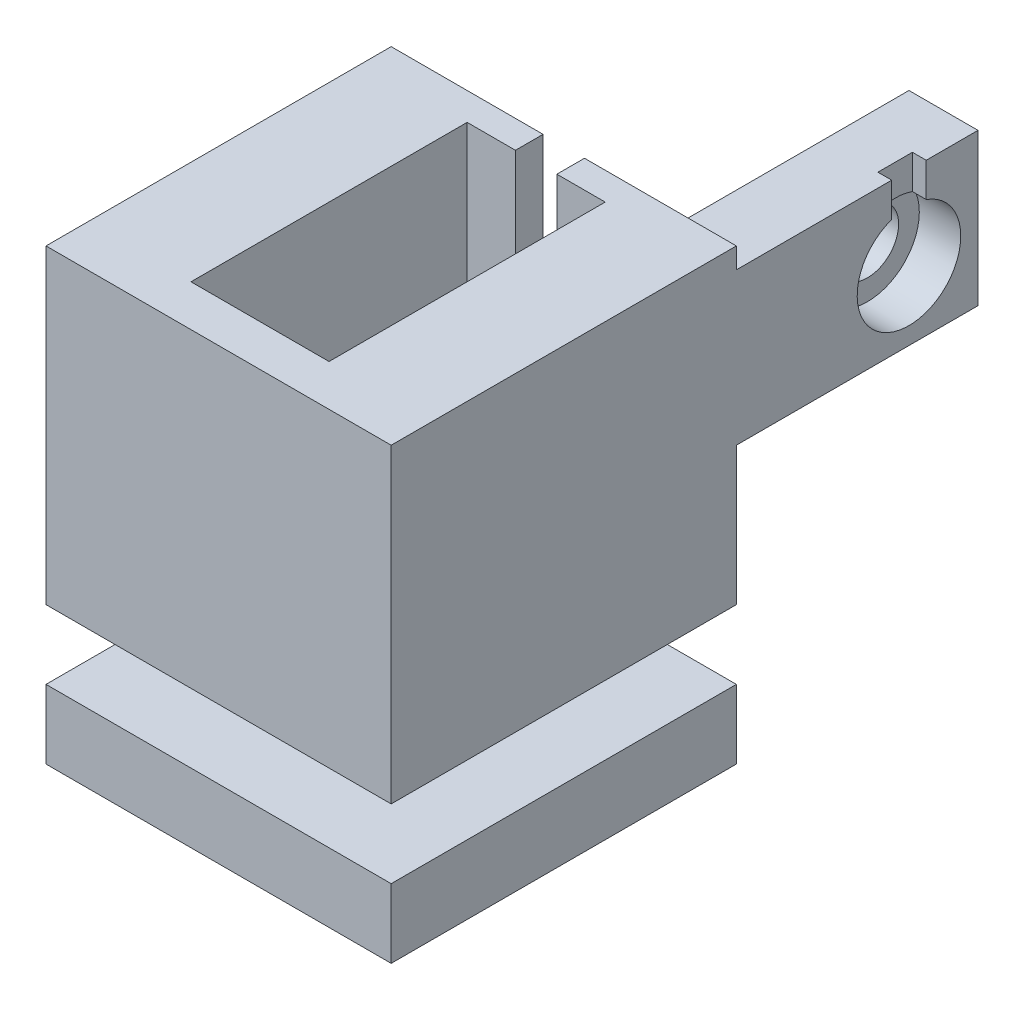
ISO-10303-21;
HEADER;
FILE_DESCRIPTION(('STEP AP214'),'2;1');
FILE_NAME('part.step','',(''),(''),'','','');
FILE_SCHEMA(('AUTOMOTIVE_DESIGN { 1 0 10303 214 1 1 1 1 }'));
ENDSEC;
DATA;
#1=APPLICATION_CONTEXT('core data for automotive mechanical design processes');
#2=APPLICATION_PROTOCOL_DEFINITION('international standard','automotive_design',2000,#1);
#3=PRODUCT_CONTEXT('',#1,'mechanical');
#4=PRODUCT('Part','Part','',(#3));
#5=PRODUCT_RELATED_PRODUCT_CATEGORY('part','',(#4));
#6=PRODUCT_DEFINITION_FORMATION('','',#4);
#7=PRODUCT_DEFINITION_CONTEXT('part definition',#1,'design');
#8=PRODUCT_DEFINITION('design','',#6,#7);
#9=PRODUCT_DEFINITION_SHAPE('','',#8);
#10=(LENGTH_UNIT() NAMED_UNIT(*) SI_UNIT(.MILLI.,.METRE.));
#11=(NAMED_UNIT(*) PLANE_ANGLE_UNIT() SI_UNIT($,.RADIAN.));
#12=(NAMED_UNIT(*) SI_UNIT($,.STERADIAN.) SOLID_ANGLE_UNIT());
#13=UNCERTAINTY_MEASURE_WITH_UNIT(LENGTH_MEASURE(1.E-05),#10,'distance_accuracy_value','');
#14=(GEOMETRIC_REPRESENTATION_CONTEXT(3) GLOBAL_UNCERTAINTY_ASSIGNED_CONTEXT((#13)) GLOBAL_UNIT_ASSIGNED_CONTEXT((#10,
#11,#12)) REPRESENTATION_CONTEXT('',''));
#15=CARTESIAN_POINT('',(0.,0.,0.));
#16=DIRECTION('',(0.,0.,1.));
#17=DIRECTION('',(1.,0.,0.));
#18=AXIS2_PLACEMENT_3D('',#15,#16,#17);
#19=CARTESIAN_POINT('',(-25.,40.,-25.));
#20=DIRECTION('',(0.,0.,1.));
#21=DIRECTION('',(1.,0.,0.));
#22=AXIS2_PLACEMENT_3D('',#19,#20,#21);
#23=PLANE('',#22);
#24=DIRECTION('',(0.,-1.,0.));
#25=VECTOR('',#24,1.);
#26=CARTESIAN_POINT('',(-25.,40.,-25.));
#27=LINE('',#26,#25);
#28=CARTESIAN_POINT('',(-25.0000000000001,10.,-24.9999999999999));
#29=VERTEX_POINT('',#28);
#30=CARTESIAN_POINT('',(-25.,0.,-25.));
#31=VERTEX_POINT('',#30);
#32=EDGE_CURVE('E379',#29,#31,#27,.T.);
#33=ORIENTED_EDGE('',*,*,#32,.F.);
#34=DIRECTION('',(1.,0.,0.));
#35=VECTOR('',#34,1.);
#36=CARTESIAN_POINT('',(15.,10.,-25.));
#37=LINE('',#36,#35);
#38=CARTESIAN_POINT('',(25.,10.,-25.));
#39=VERTEX_POINT('',#38);
#40=EDGE_CURVE('E462',#29,#39,#37,.T.);
#41=ORIENTED_EDGE('',*,*,#40,.T.);
#42=DIRECTION('',(0.,-1.,0.));
#43=VECTOR('',#42,1.);
#44=CARTESIAN_POINT('',(25.,40.,-25.));
#45=LINE('',#44,#43);
#46=CARTESIAN_POINT('',(25.,0.,-25.));
#47=VERTEX_POINT('',#46);
#48=EDGE_CURVE('E383',#39,#47,#45,.T.);
#49=ORIENTED_EDGE('',*,*,#48,.T.);
#50=DIRECTION('',(-1.,0.,0.));
#51=VECTOR('',#50,1.);
#52=CARTESIAN_POINT('',(-25.,0.,-25.));
#53=LINE('',#52,#51);
#54=EDGE_CURVE('E362',#47,#31,#53,.T.);
#55=ORIENTED_EDGE('',*,*,#54,.T.);
#56=EDGE_LOOP('',(#33,#41,#49,#55));
#57=FACE_BOUND('',#56,.T.);
#58=ADVANCED_FACE('F39',(#57),#23,.F.);
#59=CARTESIAN_POINT('',(-25.,40.,-25.));
#60=DIRECTION('',(1.,0.,0.));
#61=DIRECTION('',(0.,0.,-1.));
#62=AXIS2_PLACEMENT_3D('',#59,#60,#61);
#63=PLANE('',#62);
#64=DIRECTION('',(0.,-1.,0.));
#65=VECTOR('',#64,1.);
#66=CARTESIAN_POINT('',(-25.,40.,25.));
#67=LINE('',#66,#65);
#68=CARTESIAN_POINT('',(-25.,10.,25.));
#69=VERTEX_POINT('',#68);
#70=CARTESIAN_POINT('',(-25.,0.,25.));
#71=VERTEX_POINT('',#70);
#72=EDGE_CURVE('E375',#69,#71,#67,.T.);
#73=ORIENTED_EDGE('',*,*,#72,.F.);
#74=DIRECTION('',(0.,0.,-1.));
#75=VECTOR('',#74,1.);
#76=CARTESIAN_POINT('',(-25.0000000000001,10.,-14.9999999999999));
#77=LINE('',#76,#75);
#78=EDGE_CURVE('E446',#69,#29,#77,.T.);
#79=ORIENTED_EDGE('',*,*,#78,.T.);
#80=ORIENTED_EDGE('',*,*,#32,.T.);
#81=DIRECTION('',(0.,0.,1.));
#82=VECTOR('',#81,1.);
#83=CARTESIAN_POINT('',(-25.,0.,-25.));
#84=LINE('',#83,#82);
#85=EDGE_CURVE('E365',#31,#71,#84,.T.);
#86=ORIENTED_EDGE('',*,*,#85,.T.);
#87=EDGE_LOOP('',(#73,#79,#80,#86));
#88=FACE_BOUND('',#87,.T.);
#89=ADVANCED_FACE('F514',(#88),#63,.F.);
#90=CARTESIAN_POINT('',(-25.,40.,25.));
#91=DIRECTION('',(0.,0.,-1.));
#92=DIRECTION('',(-1.,0.,0.));
#93=AXIS2_PLACEMENT_3D('',#90,#91,#92);
#94=PLANE('',#93);
#95=DIRECTION('',(1.,0.,0.));
#96=VECTOR('',#95,1.);
#97=CARTESIAN_POINT('',(15.,9.99999999999999,25.));
#98=LINE('',#97,#96);
#99=CARTESIAN_POINT('',(25.,9.99999999999999,25.));
#100=VERTEX_POINT('',#99);
#101=EDGE_CURVE('E465',#69,#100,#98,.T.);
#102=ORIENTED_EDGE('',*,*,#101,.F.);
#103=ORIENTED_EDGE('',*,*,#72,.T.);
#104=DIRECTION('',(1.,0.,0.));
#105=VECTOR('',#104,1.);
#106=CARTESIAN_POINT('',(-25.,0.,25.));
#107=LINE('',#106,#105);
#108=CARTESIAN_POINT('',(25.,0.,25.));
#109=VERTEX_POINT('',#108);
#110=EDGE_CURVE('E368',#71,#109,#107,.T.);
#111=ORIENTED_EDGE('',*,*,#110,.T.);
#112=DIRECTION('',(0.,-1.,0.));
#113=VECTOR('',#112,1.);
#114=CARTESIAN_POINT('',(25.,40.,25.));
#115=LINE('',#114,#113);
#116=EDGE_CURVE('E371',#100,#109,#115,.T.);
#117=ORIENTED_EDGE('',*,*,#116,.F.);
#118=EDGE_LOOP('',(#102,#103,#111,#117));
#119=FACE_BOUND('',#118,.T.);
#120=ADVANCED_FACE('F509',(#119),#94,.F.);
#121=CARTESIAN_POINT('',(25.,40.,-25.));
#122=DIRECTION('',(-1.,0.,0.));
#123=DIRECTION('',(0.,0.,1.));
#124=AXIS2_PLACEMENT_3D('',#121,#122,#123);
#125=PLANE('',#124);
#126=ORIENTED_EDGE('',*,*,#48,.F.);
#127=DIRECTION('',(0.,0.,-1.));
#128=VECTOR('',#127,1.);
#129=CARTESIAN_POINT('',(25.,10.,-25.));
#130=LINE('',#129,#128);
#131=EDGE_CURVE('E456',#100,#39,#130,.T.);
#132=ORIENTED_EDGE('',*,*,#131,.F.);
#133=ORIENTED_EDGE('',*,*,#116,.T.);
#134=DIRECTION('',(0.,0.,-1.));
#135=VECTOR('',#134,1.);
#136=CARTESIAN_POINT('',(25.,0.,-25.));
#137=LINE('',#136,#135);
#138=EDGE_CURVE('E359',#109,#47,#137,.T.);
#139=ORIENTED_EDGE('',*,*,#138,.T.);
#140=EDGE_LOOP('',(#126,#132,#133,#139));
#141=FACE_BOUND('',#140,.T.);
#142=ADVANCED_FACE('F501',(#141),#125,.F.);
#143=CARTESIAN_POINT('',(-20.,50.,-25.));
#144=DIRECTION('',(0.,0.,-1.));
#145=DIRECTION('',(-1.,0.,0.));
#146=AXIS2_PLACEMENT_3D('',#143,#144,#145);
#147=CIRCLE('',#146,2.00000000000001);
#148=CARTESIAN_POINT('',(-22.,50.,-25.));
#149=VERTEX_POINT('',#148);
#150=EDGE_CURVE('E947',#149,#149,#147,.T.);
#151=ORIENTED_EDGE('',*,*,#150,.F.);
#152=EDGE_LOOP('',(#151));
#153=FACE_BOUND('',#152,.T.);
#154=DIRECTION('',(1.,0.,0.));
#155=VECTOR('',#154,1.);
#156=CARTESIAN_POINT('',(15.,20.,-25.));
#157=LINE('',#156,#155);
#158=CARTESIAN_POINT('',(-25.0000000000001,20.,-24.9999999999999));
#159=VERTEX_POINT('',#158);
#160=CARTESIAN_POINT('',(25.,20.,-25.));
#161=VERTEX_POINT('',#160);
#162=EDGE_CURVE('E459',#159,#161,#157,.T.);
#163=ORIENTED_EDGE('',*,*,#162,.F.);
#164=CARTESIAN_POINT('',(-25.,65.,-25.));
#165=VERTEX_POINT('',#164);
#166=EDGE_CURVE('E380',#165,#159,#27,.T.);
#167=ORIENTED_EDGE('',*,*,#166,.F.);
#168=DIRECTION('',(-1.,0.,0.));
#169=VECTOR('',#168,1.);
#170=CARTESIAN_POINT('',(-25.,65.,-25.));
#171=LINE('',#170,#169);
#172=CARTESIAN_POINT('',(-3.,65.,-25.));
#173=VERTEX_POINT('',#172);
#174=EDGE_CURVE('E352',#173,#165,#171,.T.);
#175=ORIENTED_EDGE('',*,*,#174,.F.);
#176=DIRECTION('',(0.,1.,0.));
#177=VECTOR('',#176,1.);
#178=CARTESIAN_POINT('',(-3.,65.,-25.));
#179=LINE('',#178,#177);
#180=CARTESIAN_POINT('',(-3.,45.,-25.));
#181=VERTEX_POINT('',#180);
#182=EDGE_CURVE('E292',#181,#173,#179,.T.);
#183=ORIENTED_EDGE('',*,*,#182,.F.);
#184=DIRECTION('',(-1.,0.,0.));
#185=VECTOR('',#184,1.);
#186=CARTESIAN_POINT('',(3.,45.,-25.));
#187=LINE('',#186,#185);
#188=CARTESIAN_POINT('',(3.,45.,-25.));
#189=VERTEX_POINT('',#188);
#190=EDGE_CURVE('E289',#189,#181,#187,.T.);
#191=ORIENTED_EDGE('',*,*,#190,.F.);
#192=DIRECTION('',(0.,-1.,0.));
#193=VECTOR('',#192,1.);
#194=CARTESIAN_POINT('',(3.,65.,-25.));
#195=LINE('',#194,#193);
#196=CARTESIAN_POINT('',(3.,65.,-25.));
#197=VERTEX_POINT('',#196);
#198=EDGE_CURVE('E286',#197,#189,#195,.T.);
#199=ORIENTED_EDGE('',*,*,#198,.F.);
#200=CARTESIAN_POINT('',(25.,65.,-25.));
#201=VERTEX_POINT('',#200);
#202=EDGE_CURVE('E353',#201,#197,#171,.T.);
#203=ORIENTED_EDGE('',*,*,#202,.F.);
#204=CARTESIAN_POINT('',(25.,62.,-25.));
#205=VERTEX_POINT('',#204);
#206=EDGE_CURVE('E392',#201,#205,#45,.T.);
#207=ORIENTED_EDGE('',*,*,#206,.T.);
#208=DIRECTION('',(1.,0.,0.));
#209=VECTOR('',#208,1.);
#210=CARTESIAN_POINT('',(25.,62.,-25.));
#211=LINE('',#210,#209);
#212=CARTESIAN_POINT('',(15.,62.,-25.));
#213=VERTEX_POINT('',#212);
#214=EDGE_CURVE('E250',#213,#205,#211,.T.);
#215=ORIENTED_EDGE('',*,*,#214,.F.);
#216=DIRECTION('',(0.,1.,0.));
#217=VECTOR('',#216,1.);
#218=CARTESIAN_POINT('',(15.,40.,-25.));
#219=LINE('',#218,#217);
#220=CARTESIAN_POINT('',(15.,40.,-25.));
#221=VERTEX_POINT('',#220);
#222=EDGE_CURVE('E272',#221,#213,#219,.T.);
#223=ORIENTED_EDGE('',*,*,#222,.F.);
#224=DIRECTION('',(-1.,0.,0.));
#225=VECTOR('',#224,1.);
#226=CARTESIAN_POINT('',(25.,40.,-25.));
#227=LINE('',#226,#225);
#228=CARTESIAN_POINT('',(25.,40.,-25.));
#229=VERTEX_POINT('',#228);
#230=EDGE_CURVE('E479',#229,#221,#227,.T.);
#231=ORIENTED_EDGE('',*,*,#230,.F.);
#232=EDGE_CURVE('E390',#229,#161,#45,.T.);
#233=ORIENTED_EDGE('',*,*,#232,.T.);
#234=EDGE_LOOP('',(#163,#167,#175,#183,#191,#199,#203,#207,#215,#223,#231,#233));
#235=FACE_BOUND('',#234,.T.);
#236=ADVANCED_FACE('F497',(#153,#235),#23,.F.);
#237=CARTESIAN_POINT('',(0.,0.,0.));
#238=DIRECTION('',(0.,1.,0.));
#239=DIRECTION('',(0.,0.,1.));
#240=AXIS2_PLACEMENT_3D('',#237,#238,#239);
#241=CYLINDRICAL_SURFACE('',#240,4.);
#242=CARTESIAN_POINT('',(0.,0.,0.));
#243=DIRECTION('',(0.,1.,0.));
#244=DIRECTION('',(0.,0.,1.));
#245=AXIS2_PLACEMENT_3D('',#242,#243,#244);
#246=CIRCLE('',#245,4.);
#247=CARTESIAN_POINT('',(0.,0.,4.));
#248=VERTEX_POINT('',#247);
#249=EDGE_CURVE('E313',#248,#248,#246,.T.);
#250=ORIENTED_EDGE('',*,*,#249,.F.);
#251=EDGE_LOOP('',(#250));
#252=FACE_BOUND('',#251,.T.);
#253=CARTESIAN_POINT('',(0.,15.,0.));
#254=DIRECTION('',(0.,1.,0.));
#255=DIRECTION('',(0.,0.,1.));
#256=AXIS2_PLACEMENT_3D('',#253,#254,#255);
#257=CIRCLE('',#256,4.);
#258=CARTESIAN_POINT('',(0.,15.,4.));
#259=VERTEX_POINT('',#258);
#260=EDGE_CURVE('E310',#259,#259,#257,.F.);
#261=ORIENTED_EDGE('',*,*,#260,.F.);
#262=EDGE_LOOP('',(#261));
#263=FACE_BOUND('',#262,.T.);
#264=ADVANCED_FACE('F500',(#252,#263),#241,.F.);
#265=DIRECTION('',(0.,0.,1.));
#266=VECTOR('',#265,1.);
#267=CARTESIAN_POINT('',(25.,62.,-60.));
#268=LINE('',#267,#266);
#269=CARTESIAN_POINT('',(25.,62.,-60.));
#270=VERTEX_POINT('',#269);
#271=CARTESIAN_POINT('',(25.,62.,-52.5));
#272=VERTEX_POINT('',#271);
#273=EDGE_CURVE('E251',#270,#272,#268,.T.);
#274=ORIENTED_EDGE('',*,*,#273,.T.);
#275=DIRECTION('',(0.,1.,0.));
#276=VECTOR('',#275,1.);
#277=CARTESIAN_POINT('',(25.,55.,-52.5));
#278=LINE('',#277,#276);
#279=CARTESIAN_POINT('',(25.,57.0710678118655,-52.5));
#280=VERTEX_POINT('',#279);
#281=EDGE_CURVE('E244',#280,#272,#278,.T.);
#282=ORIENTED_EDGE('',*,*,#281,.F.);
#283=CARTESIAN_POINT('',(25.,50.,-50.));
#284=DIRECTION('',(1.,0.,0.));
#285=DIRECTION('',(0.,0.,-1.));
#286=AXIS2_PLACEMENT_3D('',#283,#284,#285);
#287=CIRCLE('',#286,7.5);
#288=CARTESIAN_POINT('',(25.,57.0710678118655,-47.5));
#289=VERTEX_POINT('',#288);
#290=EDGE_CURVE('E243',#289,#280,#287,.T.);
#291=ORIENTED_EDGE('',*,*,#290,.F.);
#292=DIRECTION('',(0.,-1.,0.));
#293=VECTOR('',#292,1.);
#294=CARTESIAN_POINT('',(25.,55.,-47.5));
#295=LINE('',#294,#293);
#296=CARTESIAN_POINT('',(25.,62.,-47.5));
#297=VERTEX_POINT('',#296);
#298=EDGE_CURVE('E229',#297,#289,#295,.T.);
#299=ORIENTED_EDGE('',*,*,#298,.F.);
#300=EDGE_CURVE('E43',#297,#205,#268,.T.);
#301=ORIENTED_EDGE('',*,*,#300,.T.);
#302=ORIENTED_EDGE('',*,*,#206,.F.);
#303=DIRECTION('',(0.,0.,-1.));
#304=VECTOR('',#303,1.);
#305=CARTESIAN_POINT('',(25.,65.,25.));
#306=LINE('',#305,#304);
#307=CARTESIAN_POINT('',(25.,65.,25.));
#308=VERTEX_POINT('',#307);
#309=EDGE_CURVE('E349',#308,#201,#306,.T.);
#310=ORIENTED_EDGE('',*,*,#309,.F.);
#311=CARTESIAN_POINT('',(25.,20.,25.));
#312=VERTEX_POINT('',#311);
#313=EDGE_CURVE('E372',#308,#312,#115,.T.);
#314=ORIENTED_EDGE('',*,*,#313,.T.);
#315=DIRECTION('',(0.,0.,1.));
#316=VECTOR('',#315,1.);
#317=CARTESIAN_POINT('',(25.,20.,-25.));
#318=LINE('',#317,#316);
#319=EDGE_CURVE('E449',#161,#312,#318,.T.);
#320=ORIENTED_EDGE('',*,*,#319,.F.);
#321=ORIENTED_EDGE('',*,*,#232,.F.);
#322=DIRECTION('',(0.,0.,1.));
#323=VECTOR('',#322,1.);
#324=CARTESIAN_POINT('',(25.,40.,-60.));
#325=LINE('',#324,#323);
#326=CARTESIAN_POINT('',(25.,40.,-60.));
#327=VERTEX_POINT('',#326);
#328=EDGE_CURVE('E252',#327,#229,#325,.T.);
#329=ORIENTED_EDGE('',*,*,#328,.F.);
#330=DIRECTION('',(0.,-1.,0.));
#331=VECTOR('',#330,1.);
#332=CARTESIAN_POINT('',(25.,62.,-60.));
#333=LINE('',#332,#331);
#334=EDGE_CURVE('E256',#270,#327,#333,.T.);
#335=ORIENTED_EDGE('',*,*,#334,.F.);
#336=EDGE_LOOP('',(#274,#282,#291,#299,#301,#302,#310,#314,#320,#321,#329,#335));
#337=FACE_BOUND('',#336,.T.);
#338=ADVANCED_FACE('F41',(#337),#125,.F.);
#339=ORIENTED_EDGE('',*,*,#166,.T.);
#340=DIRECTION('',(0.,0.,-1.));
#341=VECTOR('',#340,1.);
#342=CARTESIAN_POINT('',(-25.0000000000001,20.,-14.9999999999999));
#343=LINE('',#342,#341);
#344=CARTESIAN_POINT('',(-25.,20.,25.));
#345=VERTEX_POINT('',#344);
#346=EDGE_CURVE('E445',#345,#159,#343,.T.);
#347=ORIENTED_EDGE('',*,*,#346,.F.);
#348=CARTESIAN_POINT('',(-25.,65.,25.));
#349=VERTEX_POINT('',#348);
#350=EDGE_CURVE('E376',#349,#345,#67,.T.);
#351=ORIENTED_EDGE('',*,*,#350,.F.);
#352=DIRECTION('',(0.,0.,1.));
#353=VECTOR('',#352,1.);
#354=CARTESIAN_POINT('',(-25.,65.,-25.));
#355=LINE('',#354,#353);
#356=EDGE_CURVE('E356',#165,#349,#355,.T.);
#357=ORIENTED_EDGE('',*,*,#356,.F.);
#358=EDGE_LOOP('',(#339,#347,#351,#357));
#359=FACE_BOUND('',#358,.T.);
#360=ADVANCED_FACE('F519',(#359),#63,.F.);
#361=ORIENTED_EDGE('',*,*,#350,.T.);
#362=DIRECTION('',(1.,0.,0.));
#363=VECTOR('',#362,1.);
#364=CARTESIAN_POINT('',(15.,20.,25.));
#365=LINE('',#364,#363);
#366=EDGE_CURVE('E467',#345,#312,#365,.T.);
#367=ORIENTED_EDGE('',*,*,#366,.T.);
#368=ORIENTED_EDGE('',*,*,#313,.F.);
#369=DIRECTION('',(1.,0.,0.));
#370=VECTOR('',#369,1.);
#371=CARTESIAN_POINT('',(-25.,65.,25.));
#372=LINE('',#371,#370);
#373=EDGE_CURVE('E346',#349,#308,#372,.T.);
#374=ORIENTED_EDGE('',*,*,#373,.F.);
#375=EDGE_LOOP('',(#361,#367,#368,#374));
#376=FACE_BOUND('',#375,.T.);
#377=ADVANCED_FACE('F535',(#376),#94,.F.);
#378=CARTESIAN_POINT('',(0.,0.,0.));
#379=DIRECTION('',(0.,1.,0.));
#380=DIRECTION('',(0.,0.,1.));
#381=AXIS2_PLACEMENT_3D('',#378,#379,#380);
#382=PLANE('',#381);
#383=ORIENTED_EDGE('',*,*,#249,.T.);
#384=EDGE_LOOP('',(#383));
#385=FACE_BOUND('',#384,.T.);
#386=ORIENTED_EDGE('',*,*,#138,.F.);
#387=ORIENTED_EDGE('',*,*,#110,.F.);
#388=ORIENTED_EDGE('',*,*,#85,.F.);
#389=ORIENTED_EDGE('',*,*,#54,.F.);
#390=EDGE_LOOP('',(#386,#387,#388,#389));
#391=FACE_BOUND('',#390,.T.);
#392=ADVANCED_FACE('F532',(#385,#391),#382,.F.);
#393=CARTESIAN_POINT('',(0.,65.,0.));
#394=DIRECTION('',(0.,1.,0.));
#395=DIRECTION('',(0.,0.,1.));
#396=AXIS2_PLACEMENT_3D('',#393,#394,#395);
#397=PLANE('',#396);
#398=DIRECTION('',(0.,0.,-1.));
#399=VECTOR('',#398,1.);
#400=CARTESIAN_POINT('',(3.,65.,25.001));
#401=LINE('',#400,#399);
#402=CARTESIAN_POINT('',(3.,65.,-21.));
#403=VERTEX_POINT('',#402);
#404=EDGE_CURVE('E294',#403,#197,#401,.T.);
#405=ORIENTED_EDGE('',*,*,#404,.F.);
#406=DIRECTION('',(-1.,0.,0.));
#407=VECTOR('',#406,1.);
#408=CARTESIAN_POINT('',(-10.,65.,-21.));
#409=LINE('',#408,#407);
#410=CARTESIAN_POINT('',(10.,65.,-21.));
#411=VERTEX_POINT('',#410);
#412=EDGE_CURVE('E323',#411,#403,#409,.T.);
#413=ORIENTED_EDGE('',*,*,#412,.F.);
#414=DIRECTION('',(0.,0.,-1.));
#415=VECTOR('',#414,1.);
#416=CARTESIAN_POINT('',(10.,65.,-21.));
#417=LINE('',#416,#415);
#418=CARTESIAN_POINT('',(10.,65.,19.));
#419=VERTEX_POINT('',#418);
#420=EDGE_CURVE('E319',#419,#411,#417,.T.);
#421=ORIENTED_EDGE('',*,*,#420,.F.);
#422=DIRECTION('',(1.,0.,0.));
#423=VECTOR('',#422,1.);
#424=CARTESIAN_POINT('',(-9.99999999999999,65.,19.));
#425=LINE('',#424,#423);
#426=CARTESIAN_POINT('',(-9.99999999999999,65.,19.));
#427=VERTEX_POINT('',#426);
#428=EDGE_CURVE('E317',#427,#419,#425,.T.);
#429=ORIENTED_EDGE('',*,*,#428,.F.);
#430=DIRECTION('',(0.,0.,1.));
#431=VECTOR('',#430,1.);
#432=CARTESIAN_POINT('',(-10.,65.,-21.));
#433=LINE('',#432,#431);
#434=CARTESIAN_POINT('',(-10.,65.,-21.));
#435=VERTEX_POINT('',#434);
#436=EDGE_CURVE('E326',#435,#427,#433,.T.);
#437=ORIENTED_EDGE('',*,*,#436,.F.);
#438=CARTESIAN_POINT('',(-3.,65.,-21.));
#439=VERTEX_POINT('',#438);
#440=EDGE_CURVE('E322',#439,#435,#409,.T.);
#441=ORIENTED_EDGE('',*,*,#440,.F.);
#442=DIRECTION('',(0.,0.,-1.));
#443=VECTOR('',#442,1.);
#444=CARTESIAN_POINT('',(-3.,65.,25.001));
#445=LINE('',#444,#443);
#446=EDGE_CURVE('E295',#439,#173,#445,.T.);
#447=ORIENTED_EDGE('',*,*,#446,.T.);
#448=ORIENTED_EDGE('',*,*,#174,.T.);
#449=ORIENTED_EDGE('',*,*,#356,.T.);
#450=ORIENTED_EDGE('',*,*,#373,.T.);
#451=ORIENTED_EDGE('',*,*,#309,.T.);
#452=ORIENTED_EDGE('',*,*,#202,.T.);
#453=EDGE_LOOP('',(#405,#413,#421,#429,#437,#441,#447,#448,#449,#450,#451,#452));
#454=FACE_BOUND('',#453,.T.);
#455=ADVANCED_FACE('F534',(#454),#397,.T.);
#456=CARTESIAN_POINT('',(-9.99999999999999,65.,19.));
#457=DIRECTION('',(0.,0.,-1.));
#458=DIRECTION('',(-1.,0.,0.));
#459=AXIS2_PLACEMENT_3D('',#456,#457,#458);
#460=PLANE('',#459);
#461=DIRECTION('',(1.,0.,0.));
#462=VECTOR('',#461,1.);
#463=CARTESIAN_POINT('',(-9.99999999999999,40.,19.));
#464=LINE('',#463,#462);
#465=CARTESIAN_POINT('',(-9.99999999999999,40.,19.));
#466=VERTEX_POINT('',#465);
#467=CARTESIAN_POINT('',(10.,40.,19.));
#468=VERTEX_POINT('',#467);
#469=EDGE_CURVE('E316',#466,#468,#464,.T.);
#470=ORIENTED_EDGE('',*,*,#469,.F.);
#471=DIRECTION('',(0.,-1.,0.));
#472=VECTOR('',#471,1.);
#473=CARTESIAN_POINT('',(-9.99999999999999,65.,19.));
#474=LINE('',#473,#472);
#475=EDGE_CURVE('E328',#427,#466,#474,.T.);
#476=ORIENTED_EDGE('',*,*,#475,.F.);
#477=ORIENTED_EDGE('',*,*,#428,.T.);
#478=DIRECTION('',(0.,-1.,0.));
#479=VECTOR('',#478,1.);
#480=CARTESIAN_POINT('',(10.,65.,19.));
#481=LINE('',#480,#479);
#482=EDGE_CURVE('E343',#419,#468,#481,.T.);
#483=ORIENTED_EDGE('',*,*,#482,.T.);
#484=EDGE_LOOP('',(#470,#476,#477,#483));
#485=FACE_BOUND('',#484,.T.);
#486=ADVANCED_FACE('F542',(#485),#460,.T.);
#487=CARTESIAN_POINT('',(10.,65.,-21.));
#488=DIRECTION('',(-1.,0.,0.));
#489=DIRECTION('',(0.,0.,1.));
#490=AXIS2_PLACEMENT_3D('',#487,#488,#489);
#491=PLANE('',#490);
#492=DIRECTION('',(0.,0.,-1.));
#493=VECTOR('',#492,1.);
#494=CARTESIAN_POINT('',(10.,40.,-21.));
#495=LINE('',#494,#493);
#496=CARTESIAN_POINT('',(10.,40.,-21.));
#497=VERTEX_POINT('',#496);
#498=EDGE_CURVE('E330',#468,#497,#495,.T.);
#499=ORIENTED_EDGE('',*,*,#498,.F.);
#500=ORIENTED_EDGE('',*,*,#482,.F.);
#501=ORIENTED_EDGE('',*,*,#420,.T.);
#502=DIRECTION('',(0.,-1.,0.));
#503=VECTOR('',#502,1.);
#504=CARTESIAN_POINT('',(10.,65.,-21.));
#505=LINE('',#504,#503);
#506=EDGE_CURVE('E340',#411,#497,#505,.T.);
#507=ORIENTED_EDGE('',*,*,#506,.T.);
#508=EDGE_LOOP('',(#499,#500,#501,#507));
#509=FACE_BOUND('',#508,.T.);
#510=ADVANCED_FACE('F652',(#509),#491,.T.);
#511=CARTESIAN_POINT('',(-10.,65.,-21.));
#512=DIRECTION('',(0.,0.,1.));
#513=DIRECTION('',(1.,0.,0.));
#514=AXIS2_PLACEMENT_3D('',#511,#512,#513);
#515=PLANE('',#514);
#516=DIRECTION('',(0.,-1.,0.));
#517=VECTOR('',#516,1.);
#518=CARTESIAN_POINT('',(3.,65.,-21.));
#519=LINE('',#518,#517);
#520=CARTESIAN_POINT('',(3.,45.,-21.));
#521=VERTEX_POINT('',#520);
#522=EDGE_CURVE('E298',#403,#521,#519,.T.);
#523=ORIENTED_EDGE('',*,*,#522,.T.);
#524=DIRECTION('',(-1.,0.,0.));
#525=VECTOR('',#524,1.);
#526=CARTESIAN_POINT('',(3.,45.,-21.));
#527=LINE('',#526,#525);
#528=CARTESIAN_POINT('',(-3.,45.,-21.));
#529=VERTEX_POINT('',#528);
#530=EDGE_CURVE('E280',#521,#529,#527,.T.);
#531=ORIENTED_EDGE('',*,*,#530,.T.);
#532=DIRECTION('',(0.,1.,0.));
#533=VECTOR('',#532,1.);
#534=CARTESIAN_POINT('',(-3.,65.,-21.));
#535=LINE('',#534,#533);
#536=EDGE_CURVE('E283',#529,#439,#535,.T.);
#537=ORIENTED_EDGE('',*,*,#536,.T.);
#538=ORIENTED_EDGE('',*,*,#440,.T.);
#539=DIRECTION('',(0.,-1.,0.));
#540=VECTOR('',#539,1.);
#541=CARTESIAN_POINT('',(-10.,65.,-21.));
#542=LINE('',#541,#540);
#543=CARTESIAN_POINT('',(-10.,40.,-21.));
#544=VERTEX_POINT('',#543);
#545=EDGE_CURVE('E337',#435,#544,#542,.T.);
#546=ORIENTED_EDGE('',*,*,#545,.T.);
#547=DIRECTION('',(-1.,0.,0.));
#548=VECTOR('',#547,1.);
#549=CARTESIAN_POINT('',(-10.,40.,-21.));
#550=LINE('',#549,#548);
#551=EDGE_CURVE('E332',#497,#544,#550,.T.);
#552=ORIENTED_EDGE('',*,*,#551,.F.);
#553=ORIENTED_EDGE('',*,*,#506,.F.);
#554=ORIENTED_EDGE('',*,*,#412,.T.);
#555=EDGE_LOOP('',(#523,#531,#537,#538,#546,#552,#553,#554));
#556=FACE_BOUND('',#555,.T.);
#557=ADVANCED_FACE('F567',(#556),#515,.T.);
#558=CARTESIAN_POINT('',(-10.,65.,-21.));
#559=DIRECTION('',(1.,0.,0.));
#560=DIRECTION('',(0.,0.,-1.));
#561=AXIS2_PLACEMENT_3D('',#558,#559,#560);
#562=PLANE('',#561);
#563=DIRECTION('',(0.,0.,1.));
#564=VECTOR('',#563,1.);
#565=CARTESIAN_POINT('',(-10.,40.,-21.));
#566=LINE('',#565,#564);
#567=EDGE_CURVE('E320',#544,#466,#566,.T.);
#568=ORIENTED_EDGE('',*,*,#567,.F.);
#569=ORIENTED_EDGE('',*,*,#545,.F.);
#570=ORIENTED_EDGE('',*,*,#436,.T.);
#571=ORIENTED_EDGE('',*,*,#475,.T.);
#572=EDGE_LOOP('',(#568,#569,#570,#571));
#573=FACE_BOUND('',#572,.T.);
#574=ADVANCED_FACE('F646',(#573),#562,.T.);
#575=CARTESIAN_POINT('',(0.,40.,0.));
#576=DIRECTION('',(0.,1.,0.));
#577=DIRECTION('',(0.,0.,1.));
#578=AXIS2_PLACEMENT_3D('',#575,#576,#577);
#579=PLANE('',#578);
#580=CARTESIAN_POINT('',(0.,40.,0.));
#581=DIRECTION('',(0.,1.,0.));
#582=DIRECTION('',(0.,0.,1.));
#583=AXIS2_PLACEMENT_3D('',#580,#581,#582);
#584=CIRCLE('',#583,6.);
#585=CARTESIAN_POINT('',(0.,40.,6.));
#586=VERTEX_POINT('',#585);
#587=EDGE_CURVE('E306',#586,#586,#584,.T.);
#588=ORIENTED_EDGE('',*,*,#587,.F.);
#589=EDGE_LOOP('',(#588));
#590=FACE_BOUND('',#589,.T.);
#591=ORIENTED_EDGE('',*,*,#469,.T.);
#592=ORIENTED_EDGE('',*,*,#498,.T.);
#593=ORIENTED_EDGE('',*,*,#551,.T.);
#594=ORIENTED_EDGE('',*,*,#567,.T.);
#595=EDGE_LOOP('',(#591,#592,#593,#594));
#596=FACE_BOUND('',#595,.T.);
#597=ADVANCED_FACE('F548',(#590,#596),#579,.T.);
#598=CARTESIAN_POINT('',(0.,15.,0.));
#599=DIRECTION('',(0.,1.,0.));
#600=DIRECTION('',(0.,0.,1.));
#601=AXIS2_PLACEMENT_3D('',#598,#599,#600);
#602=PLANE('',#601);
#603=CARTESIAN_POINT('',(0.,15.,0.));
#604=DIRECTION('',(0.,1.,0.));
#605=DIRECTION('',(0.,0.,1.));
#606=AXIS2_PLACEMENT_3D('',#603,#604,#605);
#607=CIRCLE('',#606,6.);
#608=CARTESIAN_POINT('',(0.,15.,6.));
#609=VERTEX_POINT('',#608);
#610=EDGE_CURVE('E307',#609,#609,#607,.T.);
#611=ORIENTED_EDGE('',*,*,#610,.T.);
#612=EDGE_LOOP('',(#611));
#613=FACE_BOUND('',#612,.T.);
#614=ORIENTED_EDGE('',*,*,#260,.T.);
#615=EDGE_LOOP('',(#614));
#616=FACE_BOUND('',#615,.T.);
#617=ADVANCED_FACE('F639',(#613,#616),#602,.T.);
#618=CARTESIAN_POINT('',(0.,15.,0.));
#619=DIRECTION('',(0.,1.,0.));
#620=DIRECTION('',(0.,0.,1.));
#621=AXIS2_PLACEMENT_3D('',#618,#619,#620);
#622=CYLINDRICAL_SURFACE('',#621,6.);
#623=ORIENTED_EDGE('',*,*,#610,.F.);
#624=EDGE_LOOP('',(#623));
#625=FACE_BOUND('',#624,.T.);
#626=ORIENTED_EDGE('',*,*,#587,.T.);
#627=EDGE_LOOP('',(#626));
#628=FACE_BOUND('',#627,.T.);
#629=ADVANCED_FACE('F638',(#625,#628),#622,.F.);
#630=CARTESIAN_POINT('',(3.,65.,25.001));
#631=DIRECTION('',(1.,0.,0.));
#632=DIRECTION('',(0.,1.,0.));
#633=AXIS2_PLACEMENT_3D('',#630,#631,#632);
#634=PLANE('',#633);
#635=ORIENTED_EDGE('',*,*,#404,.T.);
#636=ORIENTED_EDGE('',*,*,#198,.T.);
#637=DIRECTION('',(0.,0.,-1.));
#638=VECTOR('',#637,1.);
#639=CARTESIAN_POINT('',(3.,45.,25.001));
#640=LINE('',#639,#638);
#641=EDGE_CURVE('E301',#521,#189,#640,.T.);
#642=ORIENTED_EDGE('',*,*,#641,.F.);
#643=ORIENTED_EDGE('',*,*,#522,.F.);
#644=EDGE_LOOP('',(#635,#636,#642,#643));
#645=FACE_BOUND('',#644,.T.);
#646=ADVANCED_FACE('F573',(#645),#634,.F.);
#647=CARTESIAN_POINT('',(3.,45.,25.001));
#648=DIRECTION('',(0.,-1.,0.));
#649=DIRECTION('',(0.,0.,-1.));
#650=AXIS2_PLACEMENT_3D('',#647,#648,#649);
#651=PLANE('',#650);
#652=ORIENTED_EDGE('',*,*,#641,.T.);
#653=ORIENTED_EDGE('',*,*,#190,.T.);
#654=DIRECTION('',(0.,0.,-1.));
#655=VECTOR('',#654,1.);
#656=CARTESIAN_POINT('',(-3.,45.,25.001));
#657=LINE('',#656,#655);
#658=EDGE_CURVE('E299',#529,#181,#657,.T.);
#659=ORIENTED_EDGE('',*,*,#658,.F.);
#660=ORIENTED_EDGE('',*,*,#530,.F.);
#661=EDGE_LOOP('',(#652,#653,#659,#660));
#662=FACE_BOUND('',#661,.T.);
#663=ADVANCED_FACE('F571',(#662),#651,.F.);
#664=CARTESIAN_POINT('',(-3.,65.,25.001));
#665=DIRECTION('',(-1.,0.,0.));
#666=DIRECTION('',(0.,-1.,0.));
#667=AXIS2_PLACEMENT_3D('',#664,#665,#666);
#668=PLANE('',#667);
#669=ORIENTED_EDGE('',*,*,#658,.T.);
#670=ORIENTED_EDGE('',*,*,#182,.T.);
#671=ORIENTED_EDGE('',*,*,#446,.F.);
#672=ORIENTED_EDGE('',*,*,#536,.F.);
#673=EDGE_LOOP('',(#669,#670,#671,#672));
#674=FACE_BOUND('',#673,.T.);
#675=ADVANCED_FACE('F564',(#674),#668,.F.);
#676=CARTESIAN_POINT('',(25.,40.,-60.));
#677=DIRECTION('',(0.,1.,0.));
#678=DIRECTION('',(0.,0.,1.));
#679=AXIS2_PLACEMENT_3D('',#676,#677,#678);
#680=PLANE('',#679);
#681=ORIENTED_EDGE('',*,*,#230,.T.);
#682=DIRECTION('',(0.,0.,1.));
#683=VECTOR('',#682,1.);
#684=CARTESIAN_POINT('',(15.,40.,-60.));
#685=LINE('',#684,#683);
#686=CARTESIAN_POINT('',(15.,40.,-60.));
#687=VERTEX_POINT('',#686);
#688=EDGE_CURVE('E277',#687,#221,#685,.T.);
#689=ORIENTED_EDGE('',*,*,#688,.F.);
#690=DIRECTION('',(-1.,0.,0.));
#691=VECTOR('',#690,1.);
#692=CARTESIAN_POINT('',(25.,40.,-60.));
#693=LINE('',#692,#691);
#694=EDGE_CURVE('E271',#327,#687,#693,.T.);
#695=ORIENTED_EDGE('',*,*,#694,.F.);
#696=ORIENTED_EDGE('',*,*,#328,.T.);
#697=EDGE_LOOP('',(#681,#689,#695,#696));
#698=FACE_BOUND('',#697,.T.);
#699=ADVANCED_FACE('F493',(#698),#680,.F.);
#700=CARTESIAN_POINT('',(15.,40.,-60.));
#701=DIRECTION('',(1.,0.,0.));
#702=DIRECTION('',(0.,0.,-1.));
#703=AXIS2_PLACEMENT_3D('',#700,#701,#702);
#704=PLANE('',#703);
#705=CARTESIAN_POINT('',(15.,50.,-50.));
#706=DIRECTION('',(1.,0.,0.));
#707=DIRECTION('',(0.,0.,-1.));
#708=AXIS2_PLACEMENT_3D('',#705,#706,#707);
#709=CIRCLE('',#708,4.5);
#710=CARTESIAN_POINT('',(15.,50.,-54.5));
#711=VERTEX_POINT('',#710);
#712=EDGE_CURVE('E473',#711,#711,#709,.T.);
#713=ORIENTED_EDGE('',*,*,#712,.T.);
#714=EDGE_LOOP('',(#713));
#715=FACE_BOUND('',#714,.T.);
#716=ORIENTED_EDGE('',*,*,#222,.T.);
#717=DIRECTION('',(0.,0.,1.));
#718=VECTOR('',#717,1.);
#719=CARTESIAN_POINT('',(15.,62.,-60.));
#720=LINE('',#719,#718);
#721=CARTESIAN_POINT('',(15.,62.,-60.));
#722=VERTEX_POINT('',#721);
#723=EDGE_CURVE('E253',#722,#213,#720,.T.);
#724=ORIENTED_EDGE('',*,*,#723,.F.);
#725=DIRECTION('',(0.,1.,0.));
#726=VECTOR('',#725,1.);
#727=CARTESIAN_POINT('',(15.,40.,-60.));
#728=LINE('',#727,#726);
#729=EDGE_CURVE('E483',#687,#722,#728,.T.);
#730=ORIENTED_EDGE('',*,*,#729,.F.);
#731=ORIENTED_EDGE('',*,*,#688,.T.);
#732=EDGE_LOOP('',(#716,#724,#730,#731));
#733=FACE_BOUND('',#732,.T.);
#734=ADVANCED_FACE('F496',(#715,#733),#704,.F.);
#735=CARTESIAN_POINT('',(25.,62.,-60.));
#736=DIRECTION('',(0.,-1.,0.));
#737=DIRECTION('',(0.,0.,-1.));
#738=AXIS2_PLACEMENT_3D('',#735,#736,#737);
#739=PLANE('',#738);
#740=DIRECTION('',(0.,0.,1.));
#741=VECTOR('',#740,1.);
#742=CARTESIAN_POINT('',(23.,62.,-60.));
#743=LINE('',#742,#741);
#744=CARTESIAN_POINT('',(23.,62.,-52.5));
#745=VERTEX_POINT('',#744);
#746=CARTESIAN_POINT('',(23.,62.,-47.5));
#747=VERTEX_POINT('',#746);
#748=EDGE_CURVE('E235',#745,#747,#743,.T.);
#749=ORIENTED_EDGE('',*,*,#748,.F.);
#750=DIRECTION('',(1.,0.,0.));
#751=VECTOR('',#750,1.);
#752=CARTESIAN_POINT('',(25.,62.,-52.5));
#753=LINE('',#752,#751);
#754=EDGE_CURVE('E234',#745,#272,#753,.T.);
#755=ORIENTED_EDGE('',*,*,#754,.T.);
#756=ORIENTED_EDGE('',*,*,#273,.F.);
#757=DIRECTION('',(1.,0.,0.));
#758=VECTOR('',#757,1.);
#759=CARTESIAN_POINT('',(25.,62.,-60.));
#760=LINE('',#759,#758);
#761=EDGE_CURVE('E262',#722,#270,#760,.T.);
#762=ORIENTED_EDGE('',*,*,#761,.F.);
#763=ORIENTED_EDGE('',*,*,#723,.T.);
#764=ORIENTED_EDGE('',*,*,#214,.T.);
#765=ORIENTED_EDGE('',*,*,#300,.F.);
#766=DIRECTION('',(-1.,0.,0.));
#767=VECTOR('',#766,1.);
#768=CARTESIAN_POINT('',(25.,62.,-47.5));
#769=LINE('',#768,#767);
#770=EDGE_CURVE('E226',#297,#747,#769,.T.);
#771=ORIENTED_EDGE('',*,*,#770,.T.);
#772=EDGE_LOOP('',(#749,#755,#756,#762,#763,#764,#765,#771));
#773=FACE_BOUND('',#772,.T.);
#774=ADVANCED_FACE('F248',(#773),#739,.F.);
#775=CARTESIAN_POINT('',(0.,0.,-60.));
#776=DIRECTION('',(0.,0.,-1.));
#777=DIRECTION('',(-1.,0.,0.));
#778=AXIS2_PLACEMENT_3D('',#775,#776,#777);
#779=PLANE('',#778);
#780=ORIENTED_EDGE('',*,*,#694,.T.);
#781=ORIENTED_EDGE('',*,*,#729,.T.);
#782=ORIENTED_EDGE('',*,*,#761,.T.);
#783=ORIENTED_EDGE('',*,*,#334,.T.);
#784=EDGE_LOOP('',(#780,#781,#782,#783));
#785=FACE_BOUND('',#784,.T.);
#786=ADVANCED_FACE('F488',(#785),#779,.T.);
#787=CARTESIAN_POINT('',(19.,50.,-50.));
#788=DIRECTION('',(1.,0.,0.));
#789=DIRECTION('',(0.,0.,-1.));
#790=AXIS2_PLACEMENT_3D('',#787,#788,#789);
#791=CYLINDRICAL_SURFACE('',#790,7.5);
#792=ORIENTED_EDGE('',*,*,#290,.T.);
#793=DIRECTION('',(1.,0.,0.));
#794=VECTOR('',#793,1.);
#795=CARTESIAN_POINT('',(19.,57.0710678118655,-52.5));
#796=LINE('',#795,#794);
#797=CARTESIAN_POINT('',(23.,57.0710678118655,-52.5));
#798=VERTEX_POINT('',#797);
#799=EDGE_CURVE('E11',#280,#798,#796,.F.);
#800=ORIENTED_EDGE('',*,*,#799,.T.);
#801=CARTESIAN_POINT('',(23.,50.,-50.));
#802=DIRECTION('',(1.,0.,0.));
#803=DIRECTION('',(0.,0.,-1.));
#804=AXIS2_PLACEMENT_3D('',#801,#802,#803);
#805=CIRCLE('',#804,7.5);
#806=CARTESIAN_POINT('',(23.,57.0710678118655,-47.5));
#807=VERTEX_POINT('',#806);
#808=EDGE_CURVE('E408',#807,#798,#805,.F.);
#809=ORIENTED_EDGE('',*,*,#808,.F.);
#810=DIRECTION('',(1.,0.,0.));
#811=VECTOR('',#810,1.);
#812=CARTESIAN_POINT('',(19.,57.0710678118655,-47.5));
#813=LINE('',#812,#811);
#814=EDGE_CURVE('E49',#807,#289,#813,.T.);
#815=ORIENTED_EDGE('',*,*,#814,.T.);
#816=EDGE_LOOP('',(#792,#800,#809,#815));
#817=FACE_BOUND('',#816,.T.);
#818=CARTESIAN_POINT('',(19.,50.,-50.));
#819=DIRECTION('',(1.,0.,0.));
#820=DIRECTION('',(0.,0.,-1.));
#821=AXIS2_PLACEMENT_3D('',#818,#819,#820);
#822=CIRCLE('',#821,7.5);
#823=CARTESIAN_POINT('',(19.,50.,-57.5));
#824=VERTEX_POINT('',#823);
#825=EDGE_CURVE('E476',#824,#824,#822,.T.);
#826=ORIENTED_EDGE('',*,*,#825,.F.);
#827=EDGE_LOOP('',(#826));
#828=FACE_BOUND('',#827,.T.);
#829=ADVANCED_FACE('F412',(#817,#828),#791,.F.);
#830=CARTESIAN_POINT('',(19.,50.,-50.));
#831=DIRECTION('',(1.,0.,0.));
#832=DIRECTION('',(0.,0.,-1.));
#833=AXIS2_PLACEMENT_3D('',#830,#831,#832);
#834=PLANE('',#833);
#835=CARTESIAN_POINT('',(19.,50.,-50.));
#836=DIRECTION('',(1.,0.,0.));
#837=DIRECTION('',(0.,0.,-1.));
#838=AXIS2_PLACEMENT_3D('',#835,#836,#837);
#839=CIRCLE('',#838,4.5);
#840=CARTESIAN_POINT('',(19.,50.,-54.5));
#841=VERTEX_POINT('',#840);
#842=EDGE_CURVE('E464',#841,#841,#839,.T.);
#843=ORIENTED_EDGE('',*,*,#842,.F.);
#844=EDGE_LOOP('',(#843));
#845=FACE_BOUND('',#844,.T.);
#846=ORIENTED_EDGE('',*,*,#825,.T.);
#847=EDGE_LOOP('',(#846));
#848=FACE_BOUND('',#847,.T.);
#849=ADVANCED_FACE('F616',(#845,#848),#834,.T.);
#850=CARTESIAN_POINT('',(11.,50.,-50.));
#851=DIRECTION('',(1.,0.,0.));
#852=DIRECTION('',(0.,0.,-1.));
#853=AXIS2_PLACEMENT_3D('',#850,#851,#852);
#854=CYLINDRICAL_SURFACE('',#853,4.5);
#855=ORIENTED_EDGE('',*,*,#842,.T.);
#856=EDGE_LOOP('',(#855));
#857=FACE_BOUND('',#856,.T.);
#858=ORIENTED_EDGE('',*,*,#712,.F.);
#859=EDGE_LOOP('',(#858));
#860=FACE_BOUND('',#859,.T.);
#861=ADVANCED_FACE('F612',(#857,#860),#854,.F.);
#862=CARTESIAN_POINT('',(15.,10.,-25.));
#863=DIRECTION('',(0.,-1.,0.));
#864=DIRECTION('',(0.,0.,-1.));
#865=AXIS2_PLACEMENT_3D('',#862,#863,#864);
#866=PLANE('',#865);
#867=DIRECTION('',(-1.,0.,0.));
#868=VECTOR('',#867,1.);
#869=CARTESIAN_POINT('',(-25.0000000000001,10.,-14.9999999999999));
#870=LINE('',#869,#868);
#871=CARTESIAN_POINT('',(15.,10.,-15.0000000000001));
#872=VERTEX_POINT('',#871);
#873=CARTESIAN_POINT('',(-15.,10.,-15.));
#874=VERTEX_POINT('',#873);
#875=EDGE_CURVE('E443',#872,#874,#870,.T.);
#876=ORIENTED_EDGE('',*,*,#875,.F.);
#877=DIRECTION('',(0.,0.,-1.));
#878=VECTOR('',#877,1.);
#879=CARTESIAN_POINT('',(15.,10.,-25.));
#880=LINE('',#879,#878);
#881=CARTESIAN_POINT('',(15.,10.,14.9999999999998));
#882=VERTEX_POINT('',#881);
#883=EDGE_CURVE('E455',#882,#872,#880,.T.);
#884=ORIENTED_EDGE('',*,*,#883,.F.);
#885=DIRECTION('',(1.,0.,0.));
#886=VECTOR('',#885,1.);
#887=CARTESIAN_POINT('',(25.0000000000002,10.,14.9999999999997));
#888=LINE('',#887,#886);
#889=CARTESIAN_POINT('',(-15.,10.,15.0000000000002));
#890=VERTEX_POINT('',#889);
#891=EDGE_CURVE('E64',#890,#882,#888,.T.);
#892=ORIENTED_EDGE('',*,*,#891,.F.);
#893=DIRECTION('',(0.,0.,1.));
#894=VECTOR('',#893,1.);
#895=CARTESIAN_POINT('',(-15.,10.,25.));
#896=LINE('',#895,#894);
#897=EDGE_CURVE('E437',#874,#890,#896,.T.);
#898=ORIENTED_EDGE('',*,*,#897,.F.);
#899=EDGE_LOOP('',(#876,#884,#892,#898));
#900=FACE_BOUND('',#899,.T.);
#901=ORIENTED_EDGE('',*,*,#131,.T.);
#902=ORIENTED_EDGE('',*,*,#40,.F.);
#903=ORIENTED_EDGE('',*,*,#78,.F.);
#904=ORIENTED_EDGE('',*,*,#101,.T.);
#905=EDGE_LOOP('',(#901,#902,#903,#904));
#906=FACE_BOUND('',#905,.T.);
#907=ADVANCED_FACE('F526',(#900,#906),#866,.F.);
#908=CARTESIAN_POINT('',(15.,20.,-25.));
#909=DIRECTION('',(0.,1.,0.));
#910=DIRECTION('',(0.,0.,1.));
#911=AXIS2_PLACEMENT_3D('',#908,#909,#910);
#912=PLANE('',#911);
#913=ORIENTED_EDGE('',*,*,#319,.T.);
#914=ORIENTED_EDGE('',*,*,#366,.F.);
#915=ORIENTED_EDGE('',*,*,#346,.T.);
#916=ORIENTED_EDGE('',*,*,#162,.T.);
#917=EDGE_LOOP('',(#913,#914,#915,#916));
#918=FACE_BOUND('',#917,.T.);
#919=DIRECTION('',(0.,0.,1.));
#920=VECTOR('',#919,1.);
#921=CARTESIAN_POINT('',(15.,20.,-25.));
#922=LINE('',#921,#920);
#923=CARTESIAN_POINT('',(15.,20.,-15.0000000000001));
#924=VERTEX_POINT('',#923);
#925=CARTESIAN_POINT('',(15.,20.,14.9999999999998));
#926=VERTEX_POINT('',#925);
#927=EDGE_CURVE('E452',#924,#926,#922,.T.);
#928=ORIENTED_EDGE('',*,*,#927,.F.);
#929=DIRECTION('',(1.,0.,0.));
#930=VECTOR('',#929,1.);
#931=CARTESIAN_POINT('',(-25.0000000000001,20.,-14.9999999999999));
#932=LINE('',#931,#930);
#933=CARTESIAN_POINT('',(-15.,20.,-15.));
#934=VERTEX_POINT('',#933);
#935=EDGE_CURVE('E441',#934,#924,#932,.T.);
#936=ORIENTED_EDGE('',*,*,#935,.F.);
#937=DIRECTION('',(0.,0.,-1.));
#938=VECTOR('',#937,1.);
#939=CARTESIAN_POINT('',(-15.,20.,25.));
#940=LINE('',#939,#938);
#941=CARTESIAN_POINT('',(-15.,20.,15.0000000000002));
#942=VERTEX_POINT('',#941);
#943=EDGE_CURVE('E434',#942,#934,#940,.T.);
#944=ORIENTED_EDGE('',*,*,#943,.F.);
#945=DIRECTION('',(-1.,0.,0.));
#946=VECTOR('',#945,1.);
#947=CARTESIAN_POINT('',(25.0000000000002,20.,14.9999999999997));
#948=LINE('',#947,#946);
#949=EDGE_CURVE('E428',#926,#942,#948,.T.);
#950=ORIENTED_EDGE('',*,*,#949,.F.);
#951=EDGE_LOOP('',(#928,#936,#944,#950));
#952=FACE_BOUND('',#951,.T.);
#953=ADVANCED_FACE('F578',(#918,#952),#912,.F.);
#954=CARTESIAN_POINT('',(15.,0.,0.));
#955=DIRECTION('',(-1.,0.,0.));
#956=DIRECTION('',(0.,0.,1.));
#957=AXIS2_PLACEMENT_3D('',#954,#955,#956);
#958=PLANE('',#957);
#959=ORIENTED_EDGE('',*,*,#883,.T.);
#960=DIRECTION('',(0.,1.,0.));
#961=VECTOR('',#960,1.);
#962=CARTESIAN_POINT('',(15.,0.,-15.0000000000001));
#963=LINE('',#962,#961);
#964=EDGE_CURVE('E396',#872,#924,#963,.T.);
#965=ORIENTED_EDGE('',*,*,#964,.T.);
#966=ORIENTED_EDGE('',*,*,#927,.T.);
#967=DIRECTION('',(0.,-1.,0.));
#968=VECTOR('',#967,1.);
#969=CARTESIAN_POINT('',(15.,0.,14.9999999999998));
#970=LINE('',#969,#968);
#971=EDGE_CURVE('E393',#926,#882,#970,.T.);
#972=ORIENTED_EDGE('',*,*,#971,.T.);
#973=EDGE_LOOP('',(#959,#965,#966,#972));
#974=FACE_BOUND('',#973,.T.);
#975=ADVANCED_FACE('F581',(#974),#958,.F.);
#976=CARTESIAN_POINT('',(0.,0.,-15.));
#977=DIRECTION('',(0.,0.,1.));
#978=DIRECTION('',(1.,0.,0.));
#979=AXIS2_PLACEMENT_3D('',#976,#977,#978);
#980=PLANE('',#979);
#981=ORIENTED_EDGE('',*,*,#875,.T.);
#982=DIRECTION('',(0.,1.,0.));
#983=VECTOR('',#982,1.);
#984=CARTESIAN_POINT('',(-15.,0.,-14.9999999999999));
#985=LINE('',#984,#983);
#986=EDGE_CURVE('E439',#874,#934,#985,.T.);
#987=ORIENTED_EDGE('',*,*,#986,.T.);
#988=ORIENTED_EDGE('',*,*,#935,.T.);
#989=ORIENTED_EDGE('',*,*,#964,.F.);
#990=EDGE_LOOP('',(#981,#987,#988,#989));
#991=FACE_BOUND('',#990,.T.);
#992=ADVANCED_FACE('F591',(#991),#980,.F.);
#993=CARTESIAN_POINT('',(1.57116660247941E-13,0.,15.));
#994=DIRECTION('',(0.,0.,-1.));
#995=DIRECTION('',(-1.,0.,0.));
#996=AXIS2_PLACEMENT_3D('',#993,#994,#995);
#997=PLANE('',#996);
#998=ORIENTED_EDGE('',*,*,#949,.T.);
#999=DIRECTION('',(0.,1.,0.));
#1000=VECTOR('',#999,1.);
#1001=CARTESIAN_POINT('',(-15.,0.,15.0000000000002));
#1002=LINE('',#1001,#1000);
#1003=EDGE_CURVE('E431',#890,#942,#1002,.T.);
#1004=ORIENTED_EDGE('',*,*,#1003,.F.);
#1005=ORIENTED_EDGE('',*,*,#891,.T.);
#1006=ORIENTED_EDGE('',*,*,#971,.F.);
#1007=EDGE_LOOP('',(#998,#1004,#1005,#1006));
#1008=FACE_BOUND('',#1007,.T.);
#1009=ADVANCED_FACE('F597',(#1008),#997,.F.);
#1010=CARTESIAN_POINT('',(-15.,0.,0.));
#1011=DIRECTION('',(1.,0.,0.));
#1012=DIRECTION('',(0.,0.,-1.));
#1013=AXIS2_PLACEMENT_3D('',#1010,#1011,#1012);
#1014=PLANE('',#1013);
#1015=ORIENTED_EDGE('',*,*,#897,.T.);
#1016=ORIENTED_EDGE('',*,*,#1003,.T.);
#1017=ORIENTED_EDGE('',*,*,#943,.T.);
#1018=ORIENTED_EDGE('',*,*,#986,.F.);
#1019=EDGE_LOOP('',(#1015,#1016,#1017,#1018));
#1020=FACE_BOUND('',#1019,.T.);
#1021=ADVANCED_FACE('F596',(#1020),#1014,.F.);
#1022=CARTESIAN_POINT('',(23.,55.,-52.5));
#1023=DIRECTION('',(0.,0.,-1.));
#1024=DIRECTION('',(-1.,0.,0.));
#1025=AXIS2_PLACEMENT_3D('',#1022,#1023,#1024);
#1026=PLANE('',#1025);
#1027=DIRECTION('',(0.,1.,0.));
#1028=VECTOR('',#1027,1.);
#1029=CARTESIAN_POINT('',(23.,55.,-52.5));
#1030=LINE('',#1029,#1028);
#1031=EDGE_CURVE('E417',#798,#745,#1030,.T.);
#1032=ORIENTED_EDGE('',*,*,#1031,.F.);
#1033=ORIENTED_EDGE('',*,*,#799,.F.);
#1034=ORIENTED_EDGE('',*,*,#281,.T.);
#1035=ORIENTED_EDGE('',*,*,#754,.F.);
#1036=EDGE_LOOP('',(#1032,#1033,#1034,#1035));
#1037=FACE_BOUND('',#1036,.T.);
#1038=ADVANCED_FACE('F419',(#1037),#1026,.F.);
#1039=CARTESIAN_POINT('',(23.,55.,-47.5));
#1040=DIRECTION('',(0.,0.,1.));
#1041=DIRECTION('',(1.,0.,0.));
#1042=AXIS2_PLACEMENT_3D('',#1039,#1040,#1041);
#1043=PLANE('',#1042);
#1044=ORIENTED_EDGE('',*,*,#298,.T.);
#1045=ORIENTED_EDGE('',*,*,#814,.F.);
#1046=DIRECTION('',(0.,-1.,0.));
#1047=VECTOR('',#1046,1.);
#1048=CARTESIAN_POINT('',(23.,55.,-47.5));
#1049=LINE('',#1048,#1047);
#1050=EDGE_CURVE('E56',#747,#807,#1049,.T.);
#1051=ORIENTED_EDGE('',*,*,#1050,.F.);
#1052=ORIENTED_EDGE('',*,*,#770,.F.);
#1053=EDGE_LOOP('',(#1044,#1045,#1051,#1052));
#1054=FACE_BOUND('',#1053,.T.);
#1055=ADVANCED_FACE('F228',(#1054),#1043,.F.);
#1056=CARTESIAN_POINT('',(23.,0.,0.));
#1057=DIRECTION('',(1.,0.,0.));
#1058=DIRECTION('',(0.,0.,-1.));
#1059=AXIS2_PLACEMENT_3D('',#1056,#1057,#1058);
#1060=PLANE('',#1059);
#1061=ORIENTED_EDGE('',*,*,#748,.T.);
#1062=ORIENTED_EDGE('',*,*,#1050,.T.);
#1063=ORIENTED_EDGE('',*,*,#808,.T.);
#1064=ORIENTED_EDGE('',*,*,#1031,.T.);
#1065=EDGE_LOOP('',(#1061,#1062,#1063,#1064));
#1066=FACE_BOUND('',#1065,.T.);
#1067=ADVANCED_FACE('F416',(#1066),#1060,.T.);
#1068=CARTESIAN_POINT('',(-20.,50.,-15.));
#1069=DIRECTION('',(0.,0.,-1.));
#1070=DIRECTION('',(-1.,0.,0.));
#1071=AXIS2_PLACEMENT_3D('',#1068,#1069,#1070);
#1072=CYLINDRICAL_SURFACE('',#1071,2.00000000000001);
#1073=CARTESIAN_POINT('',(-20.,50.,-15.));
#1074=DIRECTION('',(0.,0.,-1.));
#1075=DIRECTION('',(-1.,0.,0.));
#1076=AXIS2_PLACEMENT_3D('',#1073,#1074,#1075);
#1077=CIRCLE('',#1076,2.00000000000001);
#1078=CARTESIAN_POINT('',(-22.,50.,-15.));
#1079=VERTEX_POINT('',#1078);
#1080=EDGE_CURVE('E245',#1079,#1079,#1077,.T.);
#1081=ORIENTED_EDGE('',*,*,#1080,.F.);
#1082=EDGE_LOOP('',(#1081));
#1083=FACE_BOUND('',#1082,.T.);
#1084=ORIENTED_EDGE('',*,*,#150,.T.);
#1085=EDGE_LOOP('',(#1084));
#1086=FACE_BOUND('',#1085,.T.);
#1087=ADVANCED_FACE('F912',(#1083,#1086),#1072,.F.);
#1088=CARTESIAN_POINT('',(-20.,50.,-15.));
#1089=DIRECTION('',(0.,0.,-1.));
#1090=DIRECTION('',(-1.,0.,0.));
#1091=AXIS2_PLACEMENT_3D('',#1088,#1089,#1090);
#1092=PLANE('',#1091);
#1093=ORIENTED_EDGE('',*,*,#1080,.T.);
#1094=EDGE_LOOP('',(#1093));
#1095=FACE_BOUND('',#1094,.T.);
#1096=ADVANCED_FACE('F917',(#1095),#1092,.T.);
#1097=CLOSED_SHELL('',(#58,#89,#120,#142,#236,#264,#338,#360,#377,#392,#455,#486,#510,#557,#574,
#597,#617,#629,#646,#663,#675,#699,#734,#774,#786,#829,#849,#861,#907,#953,#975,#992,#1009,
#1021,#1038,#1055,#1067,#1087,#1096));
#1098=MANIFOLD_SOLID_BREP('B2',#1097);
#1099=ADVANCED_BREP_SHAPE_REPRESENTATION('',(#18,#1098),#14);
#1100=SHAPE_DEFINITION_REPRESENTATION(#9,#1099);
ENDSEC;
END-ISO-10303-21;
